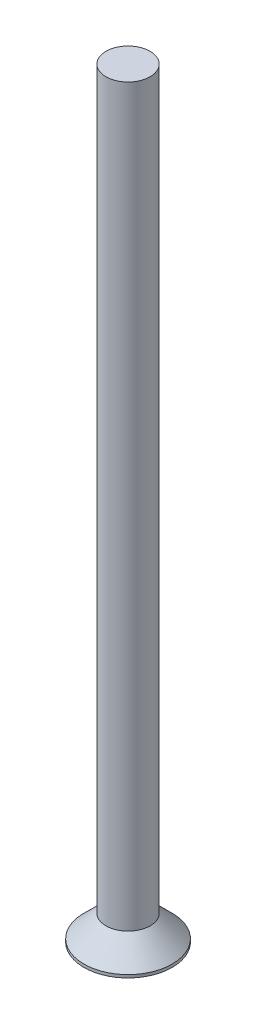
ISO-10303-21;
HEADER;
FILE_DESCRIPTION(('STEP AP214'),'2;1');
FILE_NAME('part.step','',(''),(''),'','','');
FILE_SCHEMA(('AUTOMOTIVE_DESIGN { 1 0 10303 214 1 1 1 1 }'));
ENDSEC;
DATA;
#1=APPLICATION_CONTEXT('core data for automotive mechanical design processes');
#2=APPLICATION_PROTOCOL_DEFINITION('international standard','automotive_design',2000,#1);
#3=PRODUCT_CONTEXT('',#1,'mechanical');
#4=PRODUCT('Part','Part','',(#3));
#5=PRODUCT_RELATED_PRODUCT_CATEGORY('part','',(#4));
#6=PRODUCT_DEFINITION_FORMATION('','',#4);
#7=PRODUCT_DEFINITION_CONTEXT('part definition',#1,'design');
#8=PRODUCT_DEFINITION('design','',#6,#7);
#9=PRODUCT_DEFINITION_SHAPE('','',#8);
#10=(LENGTH_UNIT() NAMED_UNIT(*) SI_UNIT(.MILLI.,.METRE.));
#11=(NAMED_UNIT(*) PLANE_ANGLE_UNIT() SI_UNIT($,.RADIAN.));
#12=(NAMED_UNIT(*) SI_UNIT($,.STERADIAN.) SOLID_ANGLE_UNIT());
#13=UNCERTAINTY_MEASURE_WITH_UNIT(LENGTH_MEASURE(1.E-05),#10,'distance_accuracy_value','');
#14=(GEOMETRIC_REPRESENTATION_CONTEXT(3) GLOBAL_UNCERTAINTY_ASSIGNED_CONTEXT((#13)) GLOBAL_UNIT_ASSIGNED_CONTEXT((#10,
#11,#12)) REPRESENTATION_CONTEXT('',''));
#15=CARTESIAN_POINT('',(0.,0.,0.));
#16=DIRECTION('',(0.,0.,1.));
#17=DIRECTION('',(1.,0.,0.));
#18=AXIS2_PLACEMENT_3D('',#15,#16,#17);
#19=CARTESIAN_POINT('',(0.,-0.200000000000001,0.));
#20=DIRECTION('',(0.,-1.,0.));
#21=DIRECTION('',(1.,0.,0.));
#22=AXIS2_PLACEMENT_3D('',#19,#20,#21);
#23=PLANE('',#22);
#24=CARTESIAN_POINT('',(0.,-0.200000000000001,0.));
#25=DIRECTION('',(0.,-1.,0.));
#26=DIRECTION('',(1.,0.,0.));
#27=AXIS2_PLACEMENT_3D('',#24,#25,#26);
#28=CIRCLE('',#27,2.99999999999999);
#29=CARTESIAN_POINT('',(2.99999999999999,-0.200000000000001,0.));
#30=VERTEX_POINT('',#29);
#31=EDGE_CURVE('E10',#30,#30,#28,.T.);
#32=ORIENTED_EDGE('',*,*,#31,.T.);
#33=EDGE_LOOP('',(#32));
#34=FACE_BOUND('',#33,.T.);
#35=ADVANCED_FACE('F31',(#34),#23,.T.);
#36=CARTESIAN_POINT('',(0.,1.5,0.));
#37=DIRECTION('',(0.,-1.,0.));
#38=DIRECTION('',(1.,0.,0.));
#39=AXIS2_PLACEMENT_3D('',#36,#37,#38);
#40=CYLINDRICAL_SURFACE('',#39,2.99999999999999);
#41=CARTESIAN_POINT('',(0.,0.,0.));
#42=DIRECTION('',(0.,-1.,0.));
#43=DIRECTION('',(1.,0.,0.));
#44=AXIS2_PLACEMENT_3D('',#41,#42,#43);
#45=CIRCLE('',#44,2.99999999999999);
#46=CARTESIAN_POINT('',(2.99999999999999,0.,0.));
#47=VERTEX_POINT('',#46);
#48=EDGE_CURVE('E37',#47,#47,#45,.T.);
#49=ORIENTED_EDGE('',*,*,#48,.T.);
#50=EDGE_LOOP('',(#49));
#51=FACE_BOUND('',#50,.T.);
#52=ORIENTED_EDGE('',*,*,#31,.F.);
#53=EDGE_LOOP('',(#52));
#54=FACE_BOUND('',#53,.T.);
#55=ADVANCED_FACE('F63',(#51,#54),#40,.T.);
#56=CARTESIAN_POINT('',(0.,0.,0.));
#57=DIRECTION('',(0.,-1.,0.));
#58=DIRECTION('',(1.,0.,0.));
#59=AXIS2_PLACEMENT_3D('',#56,#57,#58);
#60=CONICAL_SURFACE('',#59,2.99999999999999,0.785398163397447);
#61=CARTESIAN_POINT('',(0.,1.5,0.));
#62=DIRECTION('',(0.,-1.,0.));
#63=DIRECTION('',(1.,0.,0.));
#64=AXIS2_PLACEMENT_3D('',#61,#62,#63);
#65=CIRCLE('',#64,1.5);
#66=CARTESIAN_POINT('',(1.5,1.5,0.));
#67=VERTEX_POINT('',#66);
#68=EDGE_CURVE('E41',#67,#67,#65,.T.);
#69=ORIENTED_EDGE('',*,*,#68,.T.);
#70=EDGE_LOOP('',(#69));
#71=FACE_BOUND('',#70,.T.);
#72=ORIENTED_EDGE('',*,*,#48,.F.);
#73=EDGE_LOOP('',(#72));
#74=FACE_BOUND('',#73,.T.);
#75=ADVANCED_FACE('F60',(#71,#74),#60,.T.);
#76=CARTESIAN_POINT('',(0.,1.5,0.));
#77=DIRECTION('',(0.,-1.,0.));
#78=DIRECTION('',(1.,0.,0.));
#79=AXIS2_PLACEMENT_3D('',#76,#77,#78);
#80=CYLINDRICAL_SURFACE('',#79,1.5);
#81=CARTESIAN_POINT('',(0.,51.5,0.));
#82=DIRECTION('',(0.,-1.,0.));
#83=DIRECTION('',(1.,0.,0.));
#84=AXIS2_PLACEMENT_3D('',#81,#82,#83);
#85=CIRCLE('',#84,1.5);
#86=CARTESIAN_POINT('',(1.5,51.5,0.));
#87=VERTEX_POINT('',#86);
#88=EDGE_CURVE('E45',#87,#87,#85,.T.);
#89=ORIENTED_EDGE('',*,*,#88,.T.);
#90=EDGE_LOOP('',(#89));
#91=FACE_BOUND('',#90,.T.);
#92=ORIENTED_EDGE('',*,*,#68,.F.);
#93=EDGE_LOOP('',(#92));
#94=FACE_BOUND('',#93,.T.);
#95=ADVANCED_FACE('F51',(#91,#94),#80,.T.);
#96=CARTESIAN_POINT('',(0.,51.5,0.));
#97=DIRECTION('',(0.,1.,0.));
#98=DIRECTION('',(-1.,0.,0.));
#99=AXIS2_PLACEMENT_3D('',#96,#97,#98);
#100=PLANE('',#99);
#101=ORIENTED_EDGE('',*,*,#88,.F.);
#102=EDGE_LOOP('',(#101));
#103=FACE_BOUND('',#102,.T.);
#104=ADVANCED_FACE('F54',(#103),#100,.T.);
#105=CLOSED_SHELL('',(#35,#55,#75,#95,#104));
#106=MANIFOLD_SOLID_BREP('B2',#105);
#107=ADVANCED_BREP_SHAPE_REPRESENTATION('',(#18,#106),#14);
#108=SHAPE_DEFINITION_REPRESENTATION(#9,#107);
ENDSEC;
END-ISO-10303-21;
